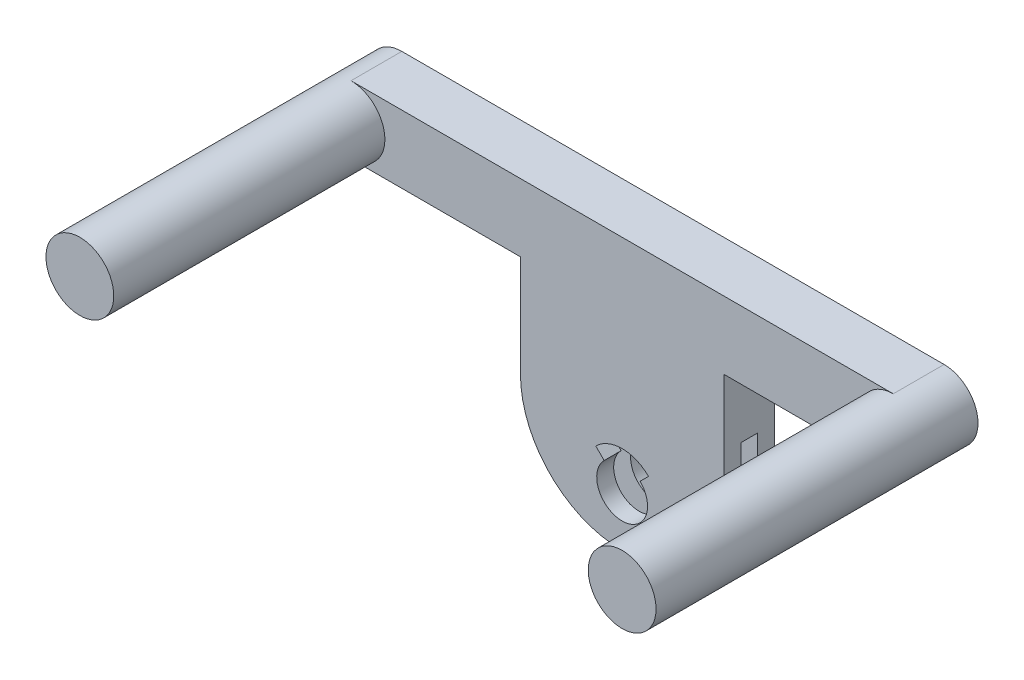
ISO-10303-21;
HEADER;
FILE_DESCRIPTION(('STEP AP214'),'2;1');
FILE_NAME('part.step','',(''),(''),'','','');
FILE_SCHEMA(('AUTOMOTIVE_DESIGN { 1 0 10303 214 1 1 1 1 }'));
ENDSEC;
DATA;
#1=APPLICATION_CONTEXT('core data for automotive mechanical design processes');
#2=APPLICATION_PROTOCOL_DEFINITION('international standard','automotive_design',2000,#1);
#3=PRODUCT_CONTEXT('',#1,'mechanical');
#4=PRODUCT('Part','Part','',(#3));
#5=PRODUCT_RELATED_PRODUCT_CATEGORY('part','',(#4));
#6=PRODUCT_DEFINITION_FORMATION('','',#4);
#7=PRODUCT_DEFINITION_CONTEXT('part definition',#1,'design');
#8=PRODUCT_DEFINITION('design','',#6,#7);
#9=PRODUCT_DEFINITION_SHAPE('','',#8);
#10=(LENGTH_UNIT() NAMED_UNIT(*) SI_UNIT(.MILLI.,.METRE.));
#11=(NAMED_UNIT(*) PLANE_ANGLE_UNIT() SI_UNIT($,.RADIAN.));
#12=(NAMED_UNIT(*) SI_UNIT($,.STERADIAN.) SOLID_ANGLE_UNIT());
#13=UNCERTAINTY_MEASURE_WITH_UNIT(LENGTH_MEASURE(1.E-05),#10,'distance_accuracy_value','');
#14=(GEOMETRIC_REPRESENTATION_CONTEXT(3) GLOBAL_UNCERTAINTY_ASSIGNED_CONTEXT((#13)) GLOBAL_UNIT_ASSIGNED_CONTEXT((#10,
#11,#12)) REPRESENTATION_CONTEXT('',''));
#15=CARTESIAN_POINT('',(0.,0.,0.));
#16=DIRECTION('',(0.,0.,1.));
#17=DIRECTION('',(1.,0.,0.));
#18=AXIS2_PLACEMENT_3D('',#15,#16,#17);
#19=CARTESIAN_POINT('',(0.,0.,30.));
#20=DIRECTION('',(0.,0.,1.));
#21=DIRECTION('',(1.,0.,0.));
#22=AXIS2_PLACEMENT_3D('',#19,#20,#21);
#23=PLANE('',#22);
#24=CARTESIAN_POINT('',(-37.7114489449618,-15.6712056100873,30.));
#25=DIRECTION('',(0.,0.,1.));
#26=DIRECTION('',(1.,0.,0.));
#27=AXIS2_PLACEMENT_3D('',#24,#25,#26);
#28=CIRCLE('',#27,15.);
#29=CARTESIAN_POINT('',(-48.31805066276,-5.06460389228905,30.));
#30=VERTEX_POINT('',#29);
#31=CARTESIAN_POINT('',(-27.1048472271637,-5.06460389228904,30.));
#32=VERTEX_POINT('',#31);
#33=EDGE_CURVE('E97',#30,#32,#28,.T.);
#34=ORIENTED_EDGE('',*,*,#33,.F.);
#35=DIRECTION('',(-0.707106781186544,0.707106781186551,0.));
#36=VECTOR('',#35,1.);
#37=CARTESIAN_POINT('',(-26.6913272775248,-26.6913272775245,30.));
#38=LINE('',#37,#36);
#39=CARTESIAN_POINT('',(-53.2677981310658,-0.114856423983192,30.));
#40=VERTEX_POINT('',#39);
#41=EDGE_CURVE('E283',#30,#40,#38,.T.);
#42=ORIENTED_EDGE('',*,*,#41,.T.);
#43=CARTESIAN_POINT('',(-37.7114489449618,-15.6712056100873,30.));
#44=DIRECTION('',(0.,0.,1.));
#45=DIRECTION('',(1.,0.,0.));
#46=AXIS2_PLACEMENT_3D('',#43,#44,#45);
#47=CIRCLE('',#46,22.);
#48=CARTESIAN_POINT('',(-22.1550997588579,-0.114856423983182,30.));
#49=VERTEX_POINT('',#48);
#50=EDGE_CURVE('E299',#49,#40,#47,.T.);
#51=ORIENTED_EDGE('',*,*,#50,.F.);
#52=DIRECTION('',(0.707106781186544,0.707106781186551,0.));
#53=VECTOR('',#52,1.);
#54=CARTESIAN_POINT('',(-11.0201216674375,11.0201216674374,30.));
#55=LINE('',#54,#53);
#56=EDGE_CURVE('E295',#32,#49,#55,.T.);
#57=ORIENTED_EDGE('',*,*,#56,.F.);
#58=EDGE_LOOP('',(#34,#42,#51,#57));
#59=FACE_BOUND('',#58,.T.);
#60=DIRECTION('',(-1.,0.,0.));
#61=VECTOR('',#60,1.);
#62=CARTESIAN_POINT('',(0.,74.3287943899127,30.));
#63=LINE('',#62,#61);
#64=CARTESIAN_POINT('',(122.288551055038,74.3287943899127,30.));
#65=VERTEX_POINT('',#64);
#66=CARTESIAN_POINT('',(22.2885510550383,74.3287943899127,30.));
#67=VERTEX_POINT('',#66);
#68=EDGE_CURVE('E224',#65,#67,#63,.T.);
#69=ORIENTED_EDGE('',*,*,#68,.F.);
#70=CARTESIAN_POINT('',(122.288551055038,94.3287943899127,30.));
#71=DIRECTION('',(0.,0.,1.));
#72=DIRECTION('',(1.,0.,0.));
#73=AXIS2_PLACEMENT_3D('',#70,#71,#72);
#74=CIRCLE('',#73,20.);
#75=CARTESIAN_POINT('',(122.288551055038,114.328794389913,30.));
#76=VERTEX_POINT('',#75);
#77=EDGE_CURVE('E230',#76,#65,#74,.T.);
#78=ORIENTED_EDGE('',*,*,#77,.F.);
#79=DIRECTION('',(1.,0.,0.));
#80=VECTOR('',#79,1.);
#81=CARTESIAN_POINT('',(0.,114.328794389913,30.));
#82=LINE('',#81,#80);
#83=CARTESIAN_POINT('',(-197.711448944962,114.328794389913,30.));
#84=VERTEX_POINT('',#83);
#85=EDGE_CURVE('E213',#84,#76,#82,.T.);
#86=ORIENTED_EDGE('',*,*,#85,.F.);
#87=CARTESIAN_POINT('',(-197.711448944962,94.3287943899126,30.));
#88=DIRECTION('',(0.,0.,1.));
#89=DIRECTION('',(1.,0.,0.));
#90=AXIS2_PLACEMENT_3D('',#87,#88,#89);
#91=CIRCLE('',#90,20.);
#92=CARTESIAN_POINT('',(-197.711448944962,74.3287943899126,30.));
#93=VERTEX_POINT('',#92);
#94=EDGE_CURVE('E12',#93,#84,#91,.T.);
#95=ORIENTED_EDGE('',*,*,#94,.F.);
#96=DIRECTION('',(-1.,0.,0.));
#97=VECTOR('',#96,1.);
#98=CARTESIAN_POINT('',(0.,74.3287943899126,30.));
#99=LINE('',#98,#97);
#100=CARTESIAN_POINT('',(-97.7114489449619,74.3287943899126,30.));
#101=VERTEX_POINT('',#100);
#102=EDGE_CURVE('E223',#101,#93,#99,.T.);
#103=ORIENTED_EDGE('',*,*,#102,.F.);
#104=DIRECTION('',(0.,1.,0.));
#105=VECTOR('',#104,1.);
#106=CARTESIAN_POINT('',(-97.7114489449619,0.,30.));
#107=LINE('',#106,#105);
#108=CARTESIAN_POINT('',(-97.7114489449619,14.3287943899127,30.));
#109=VERTEX_POINT('',#108);
#110=EDGE_CURVE('E368',#109,#101,#107,.T.);
#111=ORIENTED_EDGE('',*,*,#110,.F.);
#112=CARTESIAN_POINT('',(-37.7114489449619,14.3287943899127,30.));
#113=DIRECTION('',(0.,0.,1.));
#114=DIRECTION('',(1.,0.,0.));
#115=AXIS2_PLACEMENT_3D('',#112,#113,#114);
#116=CIRCLE('',#115,60.0000000000001);
#117=CARTESIAN_POINT('',(22.2885510550382,14.3287943899127,30.));
#118=VERTEX_POINT('',#117);
#119=EDGE_CURVE('E338',#109,#118,#116,.T.);
#120=ORIENTED_EDGE('',*,*,#119,.T.);
#121=DIRECTION('',(0.,-1.,0.));
#122=VECTOR('',#121,1.);
#123=CARTESIAN_POINT('',(22.2885510550382,0.,30.));
#124=LINE('',#123,#122);
#125=EDGE_CURVE('E372',#67,#118,#124,.T.);
#126=ORIENTED_EDGE('',*,*,#125,.F.);
#127=EDGE_LOOP('',(#69,#78,#86,#95,#103,#111,#120,#126));
#128=FACE_BOUND('',#127,.T.);
#129=ADVANCED_FACE('F72',(#59,#128),#23,.T.);
#130=CARTESIAN_POINT('',(122.288551055038,94.3287943899127,30.));
#131=DIRECTION('',(0.,0.,-1.));
#132=DIRECTION('',(-1.,0.,0.));
#133=AXIS2_PLACEMENT_3D('',#130,#131,#132);
#134=CYLINDRICAL_SURFACE('',#133,20.);
#135=CARTESIAN_POINT('',(122.288551055038,94.3287943899127,0.));
#136=DIRECTION('',(0.,0.,1.));
#137=DIRECTION('',(1.,0.,0.));
#138=AXIS2_PLACEMENT_3D('',#135,#136,#137);
#139=CIRCLE('',#138,20.);
#140=CARTESIAN_POINT('',(122.288551055038,74.3287943899127,0.));
#141=VERTEX_POINT('',#140);
#142=CARTESIAN_POINT('',(122.288551055038,114.328794389913,0.));
#143=VERTEX_POINT('',#142);
#144=EDGE_CURVE('E232',#141,#143,#139,.T.);
#145=ORIENTED_EDGE('',*,*,#144,.T.);
#146=DIRECTION('',(0.,0.,-1.));
#147=VECTOR('',#146,1.);
#148=CARTESIAN_POINT('',(122.288551055038,114.328794389913,30.));
#149=LINE('',#148,#147);
#150=EDGE_CURVE('E217',#76,#143,#149,.T.);
#151=ORIENTED_EDGE('',*,*,#150,.F.);
#152=ORIENTED_EDGE('',*,*,#77,.T.);
#153=DIRECTION('',(0.,0.,-1.));
#154=VECTOR('',#153,1.);
#155=CARTESIAN_POINT('',(122.288551055038,74.3287943899127,30.));
#156=LINE('',#155,#154);
#157=EDGE_CURVE('E235',#65,#141,#156,.T.);
#158=ORIENTED_EDGE('',*,*,#157,.T.);
#159=EDGE_LOOP('',(#145,#151,#152,#158));
#160=FACE_BOUND('',#159,.T.);
#161=CARTESIAN_POINT('',(122.288551055038,94.3287943899127,190.));
#162=DIRECTION('',(0.,0.,1.));
#163=DIRECTION('',(1.,0.,0.));
#164=AXIS2_PLACEMENT_3D('',#161,#162,#163);
#165=CIRCLE('',#164,20.);
#166=CARTESIAN_POINT('',(142.288551055038,94.3287943899127,190.));
#167=VERTEX_POINT('',#166);
#168=EDGE_CURVE('E242',#167,#167,#165,.T.);
#169=ORIENTED_EDGE('',*,*,#168,.F.);
#170=EDGE_LOOP('',(#169));
#171=FACE_BOUND('',#170,.T.);
#172=ADVANCED_FACE('F228',(#160,#171),#134,.T.);
#173=CARTESIAN_POINT('',(0.,114.328794389913,30.));
#174=DIRECTION('',(0.,1.,0.));
#175=DIRECTION('',(0.,0.,1.));
#176=AXIS2_PLACEMENT_3D('',#173,#174,#175);
#177=PLANE('',#176);
#178=DIRECTION('',(1.,0.,0.));
#179=VECTOR('',#178,1.);
#180=CARTESIAN_POINT('',(0.,114.328794389913,0.));
#181=LINE('',#180,#179);
#182=CARTESIAN_POINT('',(-197.711448944962,114.328794389913,0.));
#183=VERTEX_POINT('',#182);
#184=EDGE_CURVE('E382',#183,#143,#181,.T.);
#185=ORIENTED_EDGE('',*,*,#184,.F.);
#186=DIRECTION('',(0.,0.,-1.));
#187=VECTOR('',#186,1.);
#188=CARTESIAN_POINT('',(-197.711448944962,114.328794389913,30.));
#189=LINE('',#188,#187);
#190=EDGE_CURVE('E219',#84,#183,#189,.T.);
#191=ORIENTED_EDGE('',*,*,#190,.F.);
#192=ORIENTED_EDGE('',*,*,#85,.T.);
#193=ORIENTED_EDGE('',*,*,#150,.T.);
#194=EDGE_LOOP('',(#185,#191,#192,#193));
#195=FACE_BOUND('',#194,.T.);
#196=ADVANCED_FACE('F216',(#195),#177,.T.);
#197=CARTESIAN_POINT('',(0.,74.3287943899126,30.));
#198=DIRECTION('',(0.,-1.,0.));
#199=DIRECTION('',(0.,0.,-1.));
#200=AXIS2_PLACEMENT_3D('',#197,#198,#199);
#201=PLANE('',#200);
#202=DIRECTION('',(-1.,0.,0.));
#203=VECTOR('',#202,1.);
#204=CARTESIAN_POINT('',(0.,74.3287943899126,0.));
#205=LINE('',#204,#203);
#206=CARTESIAN_POINT('',(-97.7114489449619,74.3287943899126,0.));
#207=VERTEX_POINT('',#206);
#208=CARTESIAN_POINT('',(-197.711448944962,74.3287943899126,0.));
#209=VERTEX_POINT('',#208);
#210=EDGE_CURVE('E385',#207,#209,#205,.T.);
#211=ORIENTED_EDGE('',*,*,#210,.F.);
#212=DIRECTION('',(0.,0.,-1.));
#213=VECTOR('',#212,1.);
#214=CARTESIAN_POINT('',(-97.7114489449619,74.3287943899126,30.));
#215=LINE('',#214,#213);
#216=EDGE_CURVE('E406',#101,#207,#215,.T.);
#217=ORIENTED_EDGE('',*,*,#216,.F.);
#218=ORIENTED_EDGE('',*,*,#102,.T.);
#219=DIRECTION('',(0.,0.,-1.));
#220=VECTOR('',#219,1.);
#221=CARTESIAN_POINT('',(-197.711448944962,74.3287943899126,30.));
#222=LINE('',#221,#220);
#223=EDGE_CURVE('E409',#93,#209,#222,.T.);
#224=ORIENTED_EDGE('',*,*,#223,.T.);
#225=EDGE_LOOP('',(#211,#217,#218,#224));
#226=FACE_BOUND('',#225,.T.);
#227=ADVANCED_FACE('F486',(#226),#201,.T.);
#228=CARTESIAN_POINT('',(-97.7114489449619,0.,30.));
#229=DIRECTION('',(-1.,0.,0.));
#230=DIRECTION('',(0.,-1.,0.));
#231=AXIS2_PLACEMENT_3D('',#228,#229,#230);
#232=PLANE('',#231);
#233=DIRECTION('',(0.,-1.,0.));
#234=VECTOR('',#233,1.);
#235=CARTESIAN_POINT('',(-97.7114489449619,34.3287943899127,20.));
#236=LINE('',#235,#234);
#237=CARTESIAN_POINT('',(-97.7114489449619,34.3287943899127,20.));
#238=VERTEX_POINT('',#237);
#239=CARTESIAN_POINT('',(-97.7114489449619,14.3287943899127,20.));
#240=VERTEX_POINT('',#239);
#241=EDGE_CURVE('E267',#238,#240,#236,.T.);
#242=ORIENTED_EDGE('',*,*,#241,.T.);
#243=DIRECTION('',(0.,0.,-1.));
#244=VECTOR('',#243,1.);
#245=CARTESIAN_POINT('',(-97.7114489449619,14.3287943899127,30.));
#246=LINE('',#245,#244);
#247=EDGE_CURVE('E402',#109,#240,#246,.T.);
#248=ORIENTED_EDGE('',*,*,#247,.F.);
#249=ORIENTED_EDGE('',*,*,#110,.T.);
#250=ORIENTED_EDGE('',*,*,#216,.T.);
#251=DIRECTION('',(0.,1.,0.));
#252=VECTOR('',#251,1.);
#253=CARTESIAN_POINT('',(-97.7114489449619,0.,0.));
#254=LINE('',#253,#252);
#255=CARTESIAN_POINT('',(-97.7114489449619,14.3287943899127,0.));
#256=VERTEX_POINT('',#255);
#257=EDGE_CURVE('E389',#256,#207,#254,.T.);
#258=ORIENTED_EDGE('',*,*,#257,.F.);
#259=DIRECTION('',(0.,0.,-1.));
#260=VECTOR('',#259,1.);
#261=CARTESIAN_POINT('',(-97.7114489449619,14.3287943899127,10.));
#262=LINE('',#261,#260);
#263=CARTESIAN_POINT('',(-97.7114489449619,14.3287943899127,10.));
#264=VERTEX_POINT('',#263);
#265=EDGE_CURVE('E354',#264,#256,#262,.T.);
#266=ORIENTED_EDGE('',*,*,#265,.F.);
#267=DIRECTION('',(0.,-1.,0.));
#268=VECTOR('',#267,1.);
#269=CARTESIAN_POINT('',(-97.7114489449619,34.3287943899127,10.));
#270=LINE('',#269,#268);
#271=CARTESIAN_POINT('',(-97.7114489449619,34.3287943899127,10.));
#272=VERTEX_POINT('',#271);
#273=EDGE_CURVE('E266',#272,#264,#270,.T.);
#274=ORIENTED_EDGE('',*,*,#273,.F.);
#275=DIRECTION('',(0.,0.,-1.));
#276=VECTOR('',#275,1.);
#277=CARTESIAN_POINT('',(-97.7114489449619,34.3287943899127,10.));
#278=LINE('',#277,#276);
#279=EDGE_CURVE('E247',#238,#272,#278,.T.);
#280=ORIENTED_EDGE('',*,*,#279,.F.);
#281=EDGE_LOOP('',(#242,#248,#249,#250,#258,#266,#274,#280));
#282=FACE_BOUND('',#281,.T.);
#283=ADVANCED_FACE('F482',(#282),#232,.T.);
#284=CARTESIAN_POINT('',(22.2885510550382,0.,30.));
#285=DIRECTION('',(1.,0.,0.));
#286=DIRECTION('',(0.,1.,0.));
#287=AXIS2_PLACEMENT_3D('',#284,#285,#286);
#288=PLANE('',#287);
#289=DIRECTION('',(0.,-1.,0.));
#290=VECTOR('',#289,1.);
#291=CARTESIAN_POINT('',(22.2885510550382,34.3287943899127,20.));
#292=LINE('',#291,#290);
#293=CARTESIAN_POINT('',(22.2885510550382,34.3287943899127,20.));
#294=VERTEX_POINT('',#293);
#295=CARTESIAN_POINT('',(22.2885510550382,14.3287943899127,20.));
#296=VERTEX_POINT('',#295);
#297=EDGE_CURVE('E270',#294,#296,#292,.T.);
#298=ORIENTED_EDGE('',*,*,#297,.F.);
#299=DIRECTION('',(0.,0.,1.));
#300=VECTOR('',#299,1.);
#301=CARTESIAN_POINT('',(22.2885510550382,34.3287943899127,20.));
#302=LINE('',#301,#300);
#303=CARTESIAN_POINT('',(22.2885510550382,34.3287943899127,10.));
#304=VERTEX_POINT('',#303);
#305=EDGE_CURVE('E259',#304,#294,#302,.T.);
#306=ORIENTED_EDGE('',*,*,#305,.F.);
#307=DIRECTION('',(0.,-1.,0.));
#308=VECTOR('',#307,1.);
#309=CARTESIAN_POINT('',(22.2885510550382,34.3287943899127,10.));
#310=LINE('',#309,#308);
#311=CARTESIAN_POINT('',(22.2885510550382,14.3287943899127,10.));
#312=VERTEX_POINT('',#311);
#313=EDGE_CURVE('E273',#304,#312,#310,.T.);
#314=ORIENTED_EDGE('',*,*,#313,.T.);
#315=DIRECTION('',(0.,0.,-1.));
#316=VECTOR('',#315,1.);
#317=CARTESIAN_POINT('',(22.2885510550382,14.3287943899127,10.));
#318=LINE('',#317,#316);
#319=CARTESIAN_POINT('',(22.2885510550382,14.3287943899127,0.));
#320=VERTEX_POINT('',#319);
#321=EDGE_CURVE('E351',#312,#320,#318,.T.);
#322=ORIENTED_EDGE('',*,*,#321,.T.);
#323=DIRECTION('',(0.,-1.,0.));
#324=VECTOR('',#323,1.);
#325=CARTESIAN_POINT('',(22.2885510550382,0.,0.));
#326=LINE('',#325,#324);
#327=CARTESIAN_POINT('',(22.2885510550383,74.3287943899127,0.));
#328=VERTEX_POINT('',#327);
#329=EDGE_CURVE('E363',#328,#320,#326,.T.);
#330=ORIENTED_EDGE('',*,*,#329,.F.);
#331=DIRECTION('',(0.,0.,-1.));
#332=VECTOR('',#331,1.);
#333=CARTESIAN_POINT('',(22.2885510550383,74.3287943899127,30.));
#334=LINE('',#333,#332);
#335=EDGE_CURVE('E375',#67,#328,#334,.T.);
#336=ORIENTED_EDGE('',*,*,#335,.F.);
#337=ORIENTED_EDGE('',*,*,#125,.T.);
#338=DIRECTION('',(0.,0.,-1.));
#339=VECTOR('',#338,1.);
#340=CARTESIAN_POINT('',(22.2885510550382,14.3287943899127,30.));
#341=LINE('',#340,#339);
#342=EDGE_CURVE('E398',#118,#296,#341,.T.);
#343=ORIENTED_EDGE('',*,*,#342,.T.);
#344=EDGE_LOOP('',(#298,#306,#314,#322,#330,#336,#337,#343));
#345=FACE_BOUND('',#344,.T.);
#346=ADVANCED_FACE('F479',(#345),#288,.T.);
#347=CARTESIAN_POINT('',(0.,74.3287943899127,30.));
#348=DIRECTION('',(0.,-1.,0.));
#349=DIRECTION('',(1.,0.,0.));
#350=AXIS2_PLACEMENT_3D('',#347,#348,#349);
#351=PLANE('',#350);
#352=DIRECTION('',(-1.,0.,0.));
#353=VECTOR('',#352,1.);
#354=CARTESIAN_POINT('',(0.,74.3287943899127,0.));
#355=LINE('',#354,#353);
#356=EDGE_CURVE('E376',#141,#328,#355,.T.);
#357=ORIENTED_EDGE('',*,*,#356,.F.);
#358=ORIENTED_EDGE('',*,*,#157,.F.);
#359=ORIENTED_EDGE('',*,*,#68,.T.);
#360=ORIENTED_EDGE('',*,*,#335,.T.);
#361=EDGE_LOOP('',(#357,#358,#359,#360));
#362=FACE_BOUND('',#361,.T.);
#363=ADVANCED_FACE('F477',(#362),#351,.T.);
#364=CARTESIAN_POINT('',(0.,0.,0.));
#365=DIRECTION('',(0.,0.,1.));
#366=DIRECTION('',(1.,0.,0.));
#367=AXIS2_PLACEMENT_3D('',#364,#365,#366);
#368=PLANE('',#367);
#369=DIRECTION('',(-0.707106781186544,0.707106781186551,0.));
#370=VECTOR('',#369,1.);
#371=CARTESIAN_POINT('',(-26.6913272775248,-26.6913272775245,0.));
#372=LINE('',#371,#370);
#373=CARTESIAN_POINT('',(-48.31805066276,-5.06460389228905,0.));
#374=VERTEX_POINT('',#373);
#375=CARTESIAN_POINT('',(-53.2677981310658,-0.114856423983192,0.));
#376=VERTEX_POINT('',#375);
#377=EDGE_CURVE('E289',#374,#376,#372,.T.);
#378=ORIENTED_EDGE('',*,*,#377,.F.);
#379=CARTESIAN_POINT('',(-37.7114489449618,-15.6712056100873,0.));
#380=DIRECTION('',(0.,0.,1.));
#381=DIRECTION('',(1.,0.,0.));
#382=AXIS2_PLACEMENT_3D('',#379,#380,#381);
#383=CIRCLE('',#382,15.);
#384=CARTESIAN_POINT('',(-27.1048472271637,-5.06460389228904,0.));
#385=VERTEX_POINT('',#384);
#386=EDGE_CURVE('E278',#374,#385,#383,.T.);
#387=ORIENTED_EDGE('',*,*,#386,.T.);
#388=DIRECTION('',(0.707106781186544,0.707106781186551,0.));
#389=VECTOR('',#388,1.);
#390=CARTESIAN_POINT('',(-11.0201216674375,11.0201216674374,0.));
#391=LINE('',#390,#389);
#392=CARTESIAN_POINT('',(-22.1550997588579,-0.114856423983182,0.));
#393=VERTEX_POINT('',#392);
#394=EDGE_CURVE('E282',#385,#393,#391,.T.);
#395=ORIENTED_EDGE('',*,*,#394,.T.);
#396=CARTESIAN_POINT('',(-37.7114489449618,-15.6712056100873,0.));
#397=DIRECTION('',(0.,0.,1.));
#398=DIRECTION('',(1.,0.,0.));
#399=AXIS2_PLACEMENT_3D('',#396,#397,#398);
#400=CIRCLE('',#399,22.);
#401=EDGE_CURVE('E89',#393,#376,#400,.T.);
#402=ORIENTED_EDGE('',*,*,#401,.T.);
#403=EDGE_LOOP('',(#378,#387,#395,#402));
#404=FACE_BOUND('',#403,.T.);
#405=ORIENTED_EDGE('',*,*,#356,.T.);
#406=ORIENTED_EDGE('',*,*,#329,.T.);
#407=CARTESIAN_POINT('',(-37.7114489449618,14.3287943899127,0.));
#408=DIRECTION('',(0.,0.,-1.));
#409=DIRECTION('',(-1.,0.,0.));
#410=AXIS2_PLACEMENT_3D('',#407,#408,#409);
#411=CIRCLE('',#410,60.0000000000001);
#412=EDGE_CURVE('E343',#320,#256,#411,.T.);
#413=ORIENTED_EDGE('',*,*,#412,.T.);
#414=ORIENTED_EDGE('',*,*,#257,.T.);
#415=ORIENTED_EDGE('',*,*,#210,.T.);
#416=CARTESIAN_POINT('',(-197.711448944962,94.3287943899126,0.));
#417=DIRECTION('',(0.,0.,1.));
#418=DIRECTION('',(1.,0.,0.));
#419=AXIS2_PLACEMENT_3D('',#416,#417,#418);
#420=CIRCLE('',#419,20.);
#421=EDGE_CURVE('E358',#183,#209,#420,.T.);
#422=ORIENTED_EDGE('',*,*,#421,.F.);
#423=ORIENTED_EDGE('',*,*,#184,.T.);
#424=ORIENTED_EDGE('',*,*,#144,.F.);
#425=EDGE_LOOP('',(#405,#406,#413,#414,#415,#422,#423,#424));
#426=FACE_BOUND('',#425,.T.);
#427=ADVANCED_FACE('F474',(#404,#426),#368,.F.);
#428=CARTESIAN_POINT('',(-197.711448944962,94.3287943899126,30.));
#429=DIRECTION('',(0.,0.,-1.));
#430=DIRECTION('',(-1.,0.,0.));
#431=AXIS2_PLACEMENT_3D('',#428,#429,#430);
#432=CYLINDRICAL_SURFACE('',#431,20.);
#433=ORIENTED_EDGE('',*,*,#190,.T.);
#434=ORIENTED_EDGE('',*,*,#421,.T.);
#435=ORIENTED_EDGE('',*,*,#223,.F.);
#436=ORIENTED_EDGE('',*,*,#94,.T.);
#437=EDGE_LOOP('',(#433,#434,#435,#436));
#438=FACE_BOUND('',#437,.T.);
#439=CARTESIAN_POINT('',(-197.711448944962,94.3287943899126,190.));
#440=DIRECTION('',(0.,0.,1.));
#441=DIRECTION('',(1.,0.,0.));
#442=AXIS2_PLACEMENT_3D('',#439,#440,#441);
#443=CIRCLE('',#442,20.);
#444=CARTESIAN_POINT('',(-177.711448944962,94.3287943899126,190.));
#445=VERTEX_POINT('',#444);
#446=EDGE_CURVE('E241',#445,#445,#443,.T.);
#447=ORIENTED_EDGE('',*,*,#446,.F.);
#448=EDGE_LOOP('',(#447));
#449=FACE_BOUND('',#448,.T.);
#450=ADVANCED_FACE('F74',(#438,#449),#432,.T.);
#451=CARTESIAN_POINT('',(-37.7114489449618,14.3287943899127,10.));
#452=DIRECTION('',(0.,0.,-1.));
#453=DIRECTION('',(-1.,0.,0.));
#454=AXIS2_PLACEMENT_3D('',#451,#452,#453);
#455=CYLINDRICAL_SURFACE('',#454,60.0000000000001);
#456=ORIENTED_EDGE('',*,*,#412,.F.);
#457=ORIENTED_EDGE('',*,*,#321,.F.);
#458=CARTESIAN_POINT('',(-37.7114489449618,14.3287943899127,10.));
#459=DIRECTION('',(0.,0.,-1.));
#460=DIRECTION('',(-1.,0.,0.));
#461=AXIS2_PLACEMENT_3D('',#458,#459,#460);
#462=CIRCLE('',#461,60.0000000000001);
#463=EDGE_CURVE('E347',#312,#264,#462,.T.);
#464=ORIENTED_EDGE('',*,*,#463,.T.);
#465=ORIENTED_EDGE('',*,*,#265,.T.);
#466=EDGE_LOOP('',(#456,#457,#464,#465));
#467=FACE_BOUND('',#466,.T.);
#468=ADVANCED_FACE('F472',(#467),#455,.T.);
#469=CARTESIAN_POINT('',(0.,0.,10.));
#470=DIRECTION('',(0.,0.,-1.));
#471=DIRECTION('',(-1.,0.,0.));
#472=AXIS2_PLACEMENT_3D('',#469,#470,#471);
#473=PLANE('',#472);
#474=DIRECTION('',(-0.707106781186544,-0.707106781186551,0.));
#475=VECTOR('',#474,1.);
#476=CARTESIAN_POINT('',(-11.0201216674375,11.0201216674374,10.));
#477=LINE('',#476,#475);
#478=CARTESIAN_POINT('',(-22.1550997588579,-0.114856423983182,10.));
#479=VERTEX_POINT('',#478);
#480=CARTESIAN_POINT('',(-27.1048472271637,-5.06460389228904,10.));
#481=VERTEX_POINT('',#480);
#482=EDGE_CURVE('E310',#479,#481,#477,.T.);
#483=ORIENTED_EDGE('',*,*,#482,.T.);
#484=CARTESIAN_POINT('',(-37.7114489449618,-15.6712056100873,10.));
#485=DIRECTION('',(0.,0.,-1.));
#486=DIRECTION('',(-1.,0.,0.));
#487=AXIS2_PLACEMENT_3D('',#484,#485,#486);
#488=CIRCLE('',#487,15.);
#489=CARTESIAN_POINT('',(-48.31805066276,-5.06460389228905,10.));
#490=VERTEX_POINT('',#489);
#491=EDGE_CURVE('E334',#481,#490,#488,.T.);
#492=ORIENTED_EDGE('',*,*,#491,.T.);
#493=DIRECTION('',(0.707106781186544,-0.707106781186551,0.));
#494=VECTOR('',#493,1.);
#495=CARTESIAN_POINT('',(-26.6913272775248,-26.6913272775245,10.));
#496=LINE('',#495,#494);
#497=CARTESIAN_POINT('',(-53.2677981310658,-0.114856423983192,10.));
#498=VERTEX_POINT('',#497);
#499=EDGE_CURVE('E331',#498,#490,#496,.T.);
#500=ORIENTED_EDGE('',*,*,#499,.F.);
#501=CARTESIAN_POINT('',(-37.7114489449618,-15.6712056100873,10.));
#502=DIRECTION('',(0.,0.,-1.));
#503=DIRECTION('',(-1.,0.,0.));
#504=AXIS2_PLACEMENT_3D('',#501,#502,#503);
#505=CIRCLE('',#504,22.);
#506=EDGE_CURVE('E327',#498,#479,#505,.T.);
#507=ORIENTED_EDGE('',*,*,#506,.T.);
#508=EDGE_LOOP('',(#483,#492,#500,#507));
#509=FACE_BOUND('',#508,.T.);
#510=ORIENTED_EDGE('',*,*,#463,.F.);
#511=ORIENTED_EDGE('',*,*,#313,.F.);
#512=DIRECTION('',(1.,0.,0.));
#513=VECTOR('',#512,1.);
#514=CARTESIAN_POINT('',(22.2885510550382,34.3287943899127,10.));
#515=LINE('',#514,#513);
#516=EDGE_CURVE('E255',#272,#304,#515,.T.);
#517=ORIENTED_EDGE('',*,*,#516,.F.);
#518=ORIENTED_EDGE('',*,*,#273,.T.);
#519=EDGE_LOOP('',(#510,#511,#517,#518));
#520=FACE_BOUND('',#519,.T.);
#521=ADVANCED_FACE('F506',(#509,#520),#473,.F.);
#522=CARTESIAN_POINT('',(-37.7114489449619,14.3287943899127,20.));
#523=DIRECTION('',(0.,0.,1.));
#524=DIRECTION('',(1.,0.,0.));
#525=AXIS2_PLACEMENT_3D('',#522,#523,#524);
#526=CYLINDRICAL_SURFACE('',#525,60.0000000000001);
#527=ORIENTED_EDGE('',*,*,#119,.F.);
#528=ORIENTED_EDGE('',*,*,#247,.T.);
#529=CARTESIAN_POINT('',(-37.7114489449619,14.3287943899127,20.));
#530=DIRECTION('',(0.,0.,1.));
#531=DIRECTION('',(1.,0.,0.));
#532=AXIS2_PLACEMENT_3D('',#529,#530,#531);
#533=CIRCLE('',#532,60.0000000000001);
#534=EDGE_CURVE('E339',#240,#296,#533,.T.);
#535=ORIENTED_EDGE('',*,*,#534,.T.);
#536=ORIENTED_EDGE('',*,*,#342,.F.);
#537=EDGE_LOOP('',(#527,#528,#535,#536));
#538=FACE_BOUND('',#537,.T.);
#539=ADVANCED_FACE('F521',(#538),#526,.T.);
#540=CARTESIAN_POINT('',(0.,0.,20.));
#541=DIRECTION('',(0.,0.,1.));
#542=DIRECTION('',(1.,0.,0.));
#543=AXIS2_PLACEMENT_3D('',#540,#541,#542);
#544=PLANE('',#543);
#545=DIRECTION('',(-0.707106781186544,0.707106781186551,0.));
#546=VECTOR('',#545,1.);
#547=CARTESIAN_POINT('',(-26.6913272775248,-26.6913272775245,20.));
#548=LINE('',#547,#546);
#549=CARTESIAN_POINT('',(-48.31805066276,-5.06460389228905,20.));
#550=VERTEX_POINT('',#549);
#551=CARTESIAN_POINT('',(-53.2677981310658,-0.114856423983192,20.));
#552=VERTEX_POINT('',#551);
#553=EDGE_CURVE('E426',#550,#552,#548,.T.);
#554=ORIENTED_EDGE('',*,*,#553,.F.);
#555=CARTESIAN_POINT('',(-37.7114489449618,-15.6712056100873,20.));
#556=DIRECTION('',(0.,0.,1.));
#557=DIRECTION('',(1.,0.,0.));
#558=AXIS2_PLACEMENT_3D('',#555,#556,#557);
#559=CIRCLE('',#558,15.);
#560=CARTESIAN_POINT('',(-27.1048472271637,-5.06460389228904,20.));
#561=VERTEX_POINT('',#560);
#562=EDGE_CURVE('E76',#550,#561,#559,.T.);
#563=ORIENTED_EDGE('',*,*,#562,.T.);
#564=DIRECTION('',(0.707106781186544,0.707106781186551,0.));
#565=VECTOR('',#564,1.);
#566=CARTESIAN_POINT('',(-11.0201216674375,11.0201216674374,20.));
#567=LINE('',#566,#565);
#568=CARTESIAN_POINT('',(-22.1550997588579,-0.114856423983182,20.));
#569=VERTEX_POINT('',#568);
#570=EDGE_CURVE('E416',#561,#569,#567,.T.);
#571=ORIENTED_EDGE('',*,*,#570,.T.);
#572=CARTESIAN_POINT('',(-37.7114489449618,-15.6712056100873,20.));
#573=DIRECTION('',(0.,0.,1.));
#574=DIRECTION('',(1.,0.,0.));
#575=AXIS2_PLACEMENT_3D('',#572,#573,#574);
#576=CIRCLE('',#575,22.);
#577=EDGE_CURVE('E423',#569,#552,#576,.T.);
#578=ORIENTED_EDGE('',*,*,#577,.T.);
#579=EDGE_LOOP('',(#554,#563,#571,#578));
#580=FACE_BOUND('',#579,.T.);
#581=ORIENTED_EDGE('',*,*,#534,.F.);
#582=ORIENTED_EDGE('',*,*,#241,.F.);
#583=DIRECTION('',(-1.,0.,0.));
#584=VECTOR('',#583,1.);
#585=CARTESIAN_POINT('',(-97.7114489449619,34.3287943899127,20.));
#586=LINE('',#585,#584);
#587=EDGE_CURVE('E262',#294,#238,#586,.T.);
#588=ORIENTED_EDGE('',*,*,#587,.F.);
#589=ORIENTED_EDGE('',*,*,#297,.T.);
#590=EDGE_LOOP('',(#581,#582,#588,#589));
#591=FACE_BOUND('',#590,.T.);
#592=ADVANCED_FACE('F435',(#580,#591),#544,.F.);
#593=CARTESIAN_POINT('',(-11.0201216674375,11.0201216674374,0.));
#594=DIRECTION('',(0.707106781186551,-0.707106781186544,0.));
#595=DIRECTION('',(0.707106781186544,0.707106781186551,0.));
#596=AXIS2_PLACEMENT_3D('',#593,#594,#595);
#597=PLANE('',#596);
#598=DIRECTION('',(0.,0.,1.));
#599=VECTOR('',#598,1.);
#600=CARTESIAN_POINT('',(-27.1048472271637,-5.06460389228904,0.));
#601=LINE('',#600,#599);
#602=EDGE_CURVE('E292',#561,#32,#601,.T.);
#603=ORIENTED_EDGE('',*,*,#602,.T.);
#604=ORIENTED_EDGE('',*,*,#56,.T.);
#605=DIRECTION('',(0.,0.,1.));
#606=VECTOR('',#605,1.);
#607=CARTESIAN_POINT('',(-22.1550997588579,-0.114856423983182,0.));
#608=LINE('',#607,#606);
#609=EDGE_CURVE('E320',#569,#49,#608,.T.);
#610=ORIENTED_EDGE('',*,*,#609,.F.);
#611=ORIENTED_EDGE('',*,*,#570,.F.);
#612=EDGE_LOOP('',(#603,#604,#610,#611));
#613=FACE_BOUND('',#612,.T.);
#614=ADVANCED_FACE('F446',(#613),#597,.F.);
#615=CARTESIAN_POINT('',(-37.7114489449618,-15.6712056100873,0.));
#616=DIRECTION('',(0.,0.,1.));
#617=DIRECTION('',(1.,0.,0.));
#618=AXIS2_PLACEMENT_3D('',#615,#616,#617);
#619=CYLINDRICAL_SURFACE('',#618,22.);
#620=ORIENTED_EDGE('',*,*,#609,.T.);
#621=ORIENTED_EDGE('',*,*,#50,.T.);
#622=DIRECTION('',(0.,0.,1.));
#623=VECTOR('',#622,1.);
#624=CARTESIAN_POINT('',(-53.2677981310658,-0.114856423983192,0.));
#625=LINE('',#624,#623);
#626=EDGE_CURVE('E316',#552,#40,#625,.T.);
#627=ORIENTED_EDGE('',*,*,#626,.F.);
#628=ORIENTED_EDGE('',*,*,#577,.F.);
#629=EDGE_LOOP('',(#620,#621,#627,#628));
#630=FACE_BOUND('',#629,.T.);
#631=ADVANCED_FACE('F450',(#630),#619,.F.);
#632=CARTESIAN_POINT('',(-26.6913272775248,-26.6913272775245,0.));
#633=DIRECTION('',(0.707106781186551,0.707106781186544,0.));
#634=DIRECTION('',(-0.707106781186544,0.707106781186551,0.));
#635=AXIS2_PLACEMENT_3D('',#632,#633,#634);
#636=PLANE('',#635);
#637=ORIENTED_EDGE('',*,*,#553,.T.);
#638=ORIENTED_EDGE('',*,*,#626,.T.);
#639=ORIENTED_EDGE('',*,*,#41,.F.);
#640=DIRECTION('',(0.,0.,1.));
#641=VECTOR('',#640,1.);
#642=CARTESIAN_POINT('',(-48.31805066276,-5.06460389228905,0.));
#643=LINE('',#642,#641);
#644=EDGE_CURVE('E311',#550,#30,#643,.T.);
#645=ORIENTED_EDGE('',*,*,#644,.F.);
#646=EDGE_LOOP('',(#637,#638,#639,#645));
#647=FACE_BOUND('',#646,.T.);
#648=ADVANCED_FACE('F439',(#647),#636,.T.);
#649=CARTESIAN_POINT('',(-37.7114489449618,-15.6712056100873,0.));
#650=DIRECTION('',(0.,0.,1.));
#651=DIRECTION('',(1.,0.,0.));
#652=AXIS2_PLACEMENT_3D('',#649,#650,#651);
#653=CYLINDRICAL_SURFACE('',#652,15.);
#654=ORIENTED_EDGE('',*,*,#644,.T.);
#655=ORIENTED_EDGE('',*,*,#33,.T.);
#656=ORIENTED_EDGE('',*,*,#602,.F.);
#657=ORIENTED_EDGE('',*,*,#562,.F.);
#658=EDGE_LOOP('',(#654,#655,#656,#657));
#659=FACE_BOUND('',#658,.T.);
#660=ADVANCED_FACE('F437',(#659),#653,.F.);
#661=EDGE_CURVE('E321',#385,#481,#601,.T.);
#662=ORIENTED_EDGE('',*,*,#661,.F.);
#663=ORIENTED_EDGE('',*,*,#386,.F.);
#664=EDGE_CURVE('E306',#374,#490,#643,.T.);
#665=ORIENTED_EDGE('',*,*,#664,.T.);
#666=ORIENTED_EDGE('',*,*,#491,.F.);
#667=EDGE_LOOP('',(#662,#663,#665,#666));
#668=FACE_BOUND('',#667,.T.);
#669=ADVANCED_FACE('F538',(#668),#653,.F.);
#670=ORIENTED_EDGE('',*,*,#499,.T.);
#671=ORIENTED_EDGE('',*,*,#664,.F.);
#672=ORIENTED_EDGE('',*,*,#377,.T.);
#673=EDGE_CURVE('E312',#376,#498,#625,.T.);
#674=ORIENTED_EDGE('',*,*,#673,.T.);
#675=EDGE_LOOP('',(#670,#671,#672,#674));
#676=FACE_BOUND('',#675,.T.);
#677=ADVANCED_FACE('F460',(#676),#636,.T.);
#678=ORIENTED_EDGE('',*,*,#673,.F.);
#679=ORIENTED_EDGE('',*,*,#401,.F.);
#680=EDGE_CURVE('E317',#393,#479,#608,.T.);
#681=ORIENTED_EDGE('',*,*,#680,.T.);
#682=ORIENTED_EDGE('',*,*,#506,.F.);
#683=EDGE_LOOP('',(#678,#679,#681,#682));
#684=FACE_BOUND('',#683,.T.);
#685=ADVANCED_FACE('F454',(#684),#619,.F.);
#686=ORIENTED_EDGE('',*,*,#680,.F.);
#687=ORIENTED_EDGE('',*,*,#394,.F.);
#688=ORIENTED_EDGE('',*,*,#661,.T.);
#689=ORIENTED_EDGE('',*,*,#482,.F.);
#690=EDGE_LOOP('',(#686,#687,#688,#689));
#691=FACE_BOUND('',#690,.T.);
#692=ADVANCED_FACE('F462',(#691),#597,.F.);
#693=CARTESIAN_POINT('',(0.,34.3287943899127,0.));
#694=DIRECTION('',(0.,1.,0.));
#695=DIRECTION('',(-1.,0.,0.));
#696=AXIS2_PLACEMENT_3D('',#693,#694,#695);
#697=PLANE('',#696);
#698=ORIENTED_EDGE('',*,*,#279,.T.);
#699=ORIENTED_EDGE('',*,*,#516,.T.);
#700=ORIENTED_EDGE('',*,*,#305,.T.);
#701=ORIENTED_EDGE('',*,*,#587,.T.);
#702=EDGE_LOOP('',(#698,#699,#700,#701));
#703=FACE_BOUND('',#702,.T.);
#704=ADVANCED_FACE('F524',(#703),#697,.F.);
#705=CARTESIAN_POINT('',(-197.711448944962,94.3287943899126,190.));
#706=DIRECTION('',(0.,0.,1.));
#707=DIRECTION('',(1.,0.,0.));
#708=AXIS2_PLACEMENT_3D('',#705,#706,#707);
#709=PLANE('',#708);
#710=ORIENTED_EDGE('',*,*,#446,.T.);
#711=EDGE_LOOP('',(#710));
#712=FACE_BOUND('',#711,.T.);
#713=ADVANCED_FACE('F526',(#712),#709,.T.);
#714=CARTESIAN_POINT('',(122.288551055038,94.3287943899127,190.));
#715=DIRECTION('',(0.,0.,1.));
#716=DIRECTION('',(1.,0.,0.));
#717=AXIS2_PLACEMENT_3D('',#714,#715,#716);
#718=PLANE('',#717);
#719=ORIENTED_EDGE('',*,*,#168,.T.);
#720=EDGE_LOOP('',(#719));
#721=FACE_BOUND('',#720,.T.);
#722=ADVANCED_FACE('F532',(#721),#718,.T.);
#723=CLOSED_SHELL('',(#129,#172,#196,#227,#283,#346,#363,#427,#450,#468,#521,#539,#592,#614,
#631,#648,#660,#669,#677,#685,#692,#704,#713,#722));
#724=MANIFOLD_SOLID_BREP('B2',#723);
#725=ADVANCED_BREP_SHAPE_REPRESENTATION('',(#18,#724),#14);
#726=SHAPE_DEFINITION_REPRESENTATION(#9,#725);
ENDSEC;
END-ISO-10303-21;
